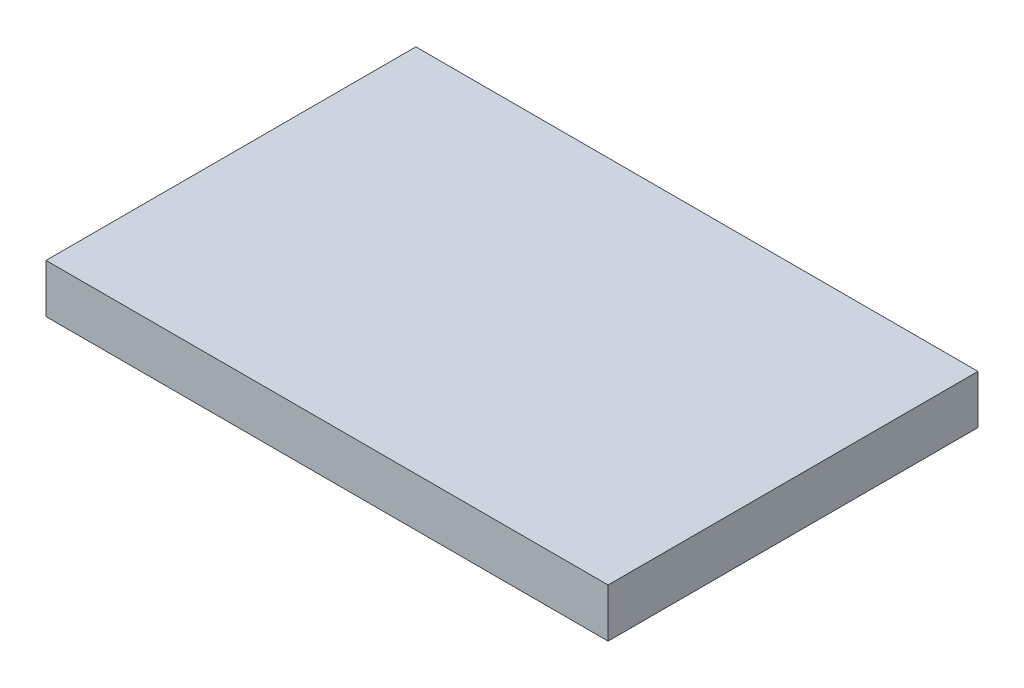
ISO-10303-21;
HEADER;
FILE_DESCRIPTION(('STEP AP214'),'2;1');
FILE_NAME('part.step','',(''),(''),'','','');
FILE_SCHEMA(('AUTOMOTIVE_DESIGN { 1 0 10303 214 1 1 1 1 }'));
ENDSEC;
DATA;
#1=APPLICATION_CONTEXT('core data for automotive mechanical design processes');
#2=APPLICATION_PROTOCOL_DEFINITION('international standard','automotive_design',2000,#1);
#3=PRODUCT_CONTEXT('',#1,'mechanical');
#4=PRODUCT('Part','Part','',(#3));
#5=PRODUCT_RELATED_PRODUCT_CATEGORY('part','',(#4));
#6=PRODUCT_DEFINITION_FORMATION('','',#4);
#7=PRODUCT_DEFINITION_CONTEXT('part definition',#1,'design');
#8=PRODUCT_DEFINITION('design','',#6,#7);
#9=PRODUCT_DEFINITION_SHAPE('','',#8);
#10=(LENGTH_UNIT() NAMED_UNIT(*) SI_UNIT(.MILLI.,.METRE.));
#11=(NAMED_UNIT(*) PLANE_ANGLE_UNIT() SI_UNIT($,.RADIAN.));
#12=(NAMED_UNIT(*) SI_UNIT($,.STERADIAN.) SOLID_ANGLE_UNIT());
#13=UNCERTAINTY_MEASURE_WITH_UNIT(LENGTH_MEASURE(1.E-05),#10,'distance_accuracy_value','');
#14=(GEOMETRIC_REPRESENTATION_CONTEXT(3) GLOBAL_UNCERTAINTY_ASSIGNED_CONTEXT((#13)) GLOBAL_UNIT_ASSIGNED_CONTEXT((#10,
#11,#12)) REPRESENTATION_CONTEXT('',''));
#15=CARTESIAN_POINT('',(0.,0.,0.));
#16=DIRECTION('',(0.,0.,1.));
#17=DIRECTION('',(1.,0.,0.));
#18=AXIS2_PLACEMENT_3D('',#15,#16,#17);
#19=CARTESIAN_POINT('',(-23.1,4.,15.2));
#20=DIRECTION('',(1.,0.,0.));
#21=DIRECTION('',(0.,0.,-1.));
#22=AXIS2_PLACEMENT_3D('',#19,#20,#21);
#23=PLANE('',#22);
#24=DIRECTION('',(0.,0.,1.));
#25=VECTOR('',#24,1.);
#26=CARTESIAN_POINT('',(-23.1,0.,15.2));
#27=LINE('',#26,#25);
#28=CARTESIAN_POINT('',(-23.1,0.,-15.2));
#29=VERTEX_POINT('',#28);
#30=CARTESIAN_POINT('',(-23.1,0.,15.2));
#31=VERTEX_POINT('',#30);
#32=EDGE_CURVE('E99',#29,#31,#27,.T.);
#33=ORIENTED_EDGE('',*,*,#32,.T.);
#34=DIRECTION('',(0.,-1.,0.));
#35=VECTOR('',#34,1.);
#36=CARTESIAN_POINT('',(-23.1,4.,15.2));
#37=LINE('',#36,#35);
#38=CARTESIAN_POINT('',(-23.1,4.,15.2));
#39=VERTEX_POINT('',#38);
#40=EDGE_CURVE('E11',#39,#31,#37,.T.);
#41=ORIENTED_EDGE('',*,*,#40,.F.);
#42=DIRECTION('',(0.,0.,1.));
#43=VECTOR('',#42,1.);
#44=CARTESIAN_POINT('',(-23.1,4.,15.2));
#45=LINE('',#44,#43);
#46=CARTESIAN_POINT('',(-23.1,4.,-15.2));
#47=VERTEX_POINT('',#46);
#48=EDGE_CURVE('E87',#47,#39,#45,.T.);
#49=ORIENTED_EDGE('',*,*,#48,.F.);
#50=DIRECTION('',(0.,-1.,0.));
#51=VECTOR('',#50,1.);
#52=CARTESIAN_POINT('',(-23.1,4.,-15.2));
#53=LINE('',#52,#51);
#54=EDGE_CURVE('E95',#47,#29,#53,.T.);
#55=ORIENTED_EDGE('',*,*,#54,.T.);
#56=EDGE_LOOP('',(#33,#41,#49,#55));
#57=FACE_BOUND('',#56,.T.);
#58=ADVANCED_FACE('F36',(#57),#23,.F.);
#59=CARTESIAN_POINT('',(23.1,4.,15.2));
#60=DIRECTION('',(0.,0.,-1.));
#61=DIRECTION('',(-1.,0.,0.));
#62=AXIS2_PLACEMENT_3D('',#59,#60,#61);
#63=PLANE('',#62);
#64=DIRECTION('',(1.,0.,0.));
#65=VECTOR('',#64,1.);
#66=CARTESIAN_POINT('',(23.1,0.,15.2));
#67=LINE('',#66,#65);
#68=CARTESIAN_POINT('',(23.1,0.,15.2));
#69=VERTEX_POINT('',#68);
#70=EDGE_CURVE('E91',#31,#69,#67,.T.);
#71=ORIENTED_EDGE('',*,*,#70,.T.);
#72=DIRECTION('',(0.,-1.,0.));
#73=VECTOR('',#72,1.);
#74=CARTESIAN_POINT('',(23.1,4.,15.2));
#75=LINE('',#74,#73);
#76=CARTESIAN_POINT('',(23.1,4.,15.2));
#77=VERTEX_POINT('',#76);
#78=EDGE_CURVE('E44',#77,#69,#75,.T.);
#79=ORIENTED_EDGE('',*,*,#78,.F.);
#80=DIRECTION('',(1.,0.,0.));
#81=VECTOR('',#80,1.);
#82=CARTESIAN_POINT('',(23.1,4.,15.2));
#83=LINE('',#82,#81);
#84=EDGE_CURVE('E82',#39,#77,#83,.T.);
#85=ORIENTED_EDGE('',*,*,#84,.F.);
#86=ORIENTED_EDGE('',*,*,#40,.T.);
#87=EDGE_LOOP('',(#71,#79,#85,#86));
#88=FACE_BOUND('',#87,.T.);
#89=ADVANCED_FACE('F90',(#88),#63,.F.);
#90=CARTESIAN_POINT('',(23.1,4.,15.2));
#91=DIRECTION('',(-1.,0.,0.));
#92=DIRECTION('',(0.,0.,1.));
#93=AXIS2_PLACEMENT_3D('',#90,#91,#92);
#94=PLANE('',#93);
#95=DIRECTION('',(0.,0.,-1.));
#96=VECTOR('',#95,1.);
#97=CARTESIAN_POINT('',(23.1,0.,15.2));
#98=LINE('',#97,#96);
#99=CARTESIAN_POINT('',(23.1,0.,-15.2));
#100=VERTEX_POINT('',#99);
#101=EDGE_CURVE('E69',#69,#100,#98,.T.);
#102=ORIENTED_EDGE('',*,*,#101,.T.);
#103=DIRECTION('',(0.,-1.,0.));
#104=VECTOR('',#103,1.);
#105=CARTESIAN_POINT('',(23.1,4.,-15.2));
#106=LINE('',#105,#104);
#107=CARTESIAN_POINT('',(23.1,4.,-15.2));
#108=VERTEX_POINT('',#107);
#109=EDGE_CURVE('E92',#108,#100,#106,.T.);
#110=ORIENTED_EDGE('',*,*,#109,.F.);
#111=DIRECTION('',(0.,0.,-1.));
#112=VECTOR('',#111,1.);
#113=CARTESIAN_POINT('',(23.1,4.,15.2));
#114=LINE('',#113,#112);
#115=EDGE_CURVE('E85',#77,#108,#114,.T.);
#116=ORIENTED_EDGE('',*,*,#115,.F.);
#117=ORIENTED_EDGE('',*,*,#78,.T.);
#118=EDGE_LOOP('',(#102,#110,#116,#117));
#119=FACE_BOUND('',#118,.T.);
#120=ADVANCED_FACE('F93',(#119),#94,.F.);
#121=CARTESIAN_POINT('',(23.1,4.,-15.2));
#122=DIRECTION('',(0.,0.,1.));
#123=DIRECTION('',(1.,0.,0.));
#124=AXIS2_PLACEMENT_3D('',#121,#122,#123);
#125=PLANE('',#124);
#126=DIRECTION('',(-1.,0.,0.));
#127=VECTOR('',#126,1.);
#128=CARTESIAN_POINT('',(23.1,0.,-15.2));
#129=LINE('',#128,#127);
#130=EDGE_CURVE('E75',#100,#29,#129,.T.);
#131=ORIENTED_EDGE('',*,*,#130,.T.);
#132=ORIENTED_EDGE('',*,*,#54,.F.);
#133=DIRECTION('',(-1.,0.,0.));
#134=VECTOR('',#133,1.);
#135=CARTESIAN_POINT('',(23.1,4.,-15.2));
#136=LINE('',#135,#134);
#137=EDGE_CURVE('E52',#108,#47,#136,.T.);
#138=ORIENTED_EDGE('',*,*,#137,.F.);
#139=ORIENTED_EDGE('',*,*,#109,.T.);
#140=EDGE_LOOP('',(#131,#132,#138,#139));
#141=FACE_BOUND('',#140,.T.);
#142=ADVANCED_FACE('F106',(#141),#125,.F.);
#143=CARTESIAN_POINT('',(0.,4.,0.));
#144=DIRECTION('',(0.,1.,0.));
#145=DIRECTION('',(0.,0.,1.));
#146=AXIS2_PLACEMENT_3D('',#143,#144,#145);
#147=PLANE('',#146);
#148=ORIENTED_EDGE('',*,*,#48,.T.);
#149=ORIENTED_EDGE('',*,*,#84,.T.);
#150=ORIENTED_EDGE('',*,*,#115,.T.);
#151=ORIENTED_EDGE('',*,*,#137,.T.);
#152=EDGE_LOOP('',(#148,#149,#150,#151));
#153=FACE_BOUND('',#152,.T.);
#154=ADVANCED_FACE('F83',(#153),#147,.T.);
#155=CARTESIAN_POINT('',(0.,0.,0.));
#156=DIRECTION('',(0.,1.,0.));
#157=DIRECTION('',(0.,0.,1.));
#158=AXIS2_PLACEMENT_3D('',#155,#156,#157);
#159=PLANE('',#158);
#160=ORIENTED_EDGE('',*,*,#32,.F.);
#161=ORIENTED_EDGE('',*,*,#130,.F.);
#162=ORIENTED_EDGE('',*,*,#101,.F.);
#163=ORIENTED_EDGE('',*,*,#70,.F.);
#164=EDGE_LOOP('',(#160,#161,#162,#163));
#165=FACE_BOUND('',#164,.T.);
#166=ADVANCED_FACE('F109',(#165),#159,.F.);
#167=CLOSED_SHELL('',(#58,#89,#120,#142,#154,#166));
#168=MANIFOLD_SOLID_BREP('B2',#167);
#169=ADVANCED_BREP_SHAPE_REPRESENTATION('',(#18,#168),#14);
#170=SHAPE_DEFINITION_REPRESENTATION(#9,#169);
ENDSEC;
END-ISO-10303-21;
